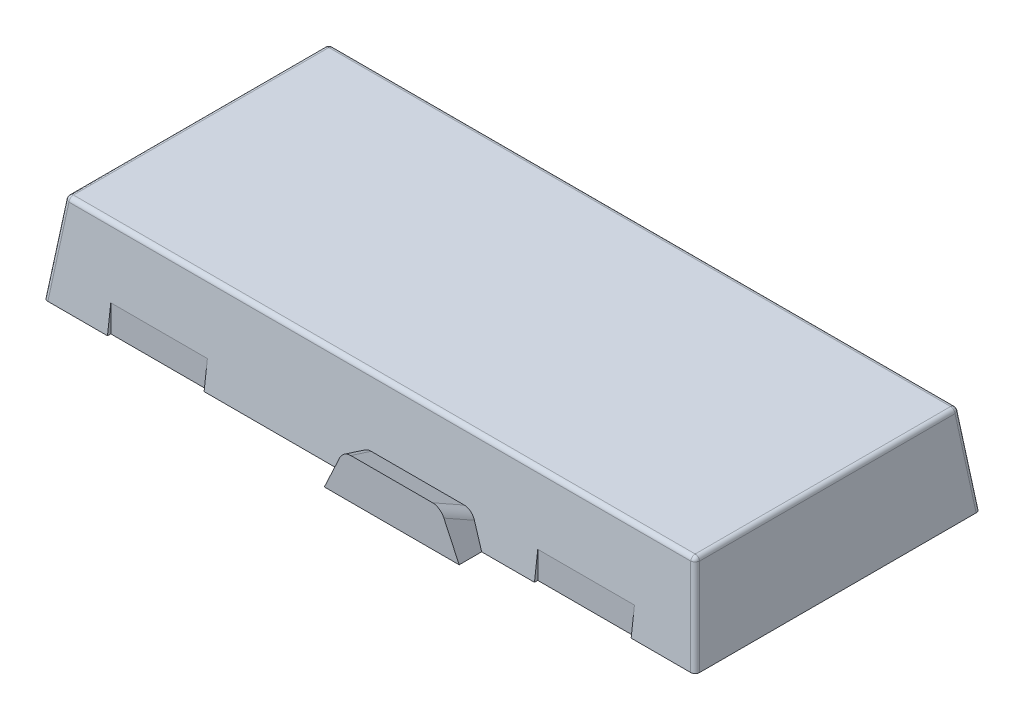
ISO-10303-21;
HEADER;
FILE_DESCRIPTION(('STEP AP214'),'2;1');
FILE_NAME('part.step','',(''),(''),'','','');
FILE_SCHEMA(('AUTOMOTIVE_DESIGN { 1 0 10303 214 1 1 1 1 }'));
ENDSEC;
DATA;
#1=APPLICATION_CONTEXT('core data for automotive mechanical design processes');
#2=APPLICATION_PROTOCOL_DEFINITION('international standard','automotive_design',2000,#1);
#3=PRODUCT_CONTEXT('',#1,'mechanical');
#4=PRODUCT('Part','Part','',(#3));
#5=PRODUCT_RELATED_PRODUCT_CATEGORY('part','',(#4));
#6=PRODUCT_DEFINITION_FORMATION('','',#4);
#7=PRODUCT_DEFINITION_CONTEXT('part definition',#1,'design');
#8=PRODUCT_DEFINITION('design','',#6,#7);
#9=PRODUCT_DEFINITION_SHAPE('','',#8);
#10=(LENGTH_UNIT() NAMED_UNIT(*) SI_UNIT(.MILLI.,.METRE.));
#11=(NAMED_UNIT(*) PLANE_ANGLE_UNIT() SI_UNIT($,.RADIAN.));
#12=(NAMED_UNIT(*) SI_UNIT($,.STERADIAN.) SOLID_ANGLE_UNIT());
#13=UNCERTAINTY_MEASURE_WITH_UNIT(LENGTH_MEASURE(1.E-05),#10,'distance_accuracy_value','');
#14=(GEOMETRIC_REPRESENTATION_CONTEXT(3) GLOBAL_UNCERTAINTY_ASSIGNED_CONTEXT((#13)) GLOBAL_UNIT_ASSIGNED_CONTEXT((#10,
#11,#12)) REPRESENTATION_CONTEXT('',''));
#15=CARTESIAN_POINT('',(0.,0.,0.));
#16=DIRECTION('',(0.,0.,1.));
#17=DIRECTION('',(1.,0.,0.));
#18=AXIS2_PLACEMENT_3D('',#15,#16,#17);
#19=CARTESIAN_POINT('',(1.11499999999994,0.,-1.25526585269165));
#20=DIRECTION('',(0.,0.,-1.));
#21=DIRECTION('',(-1.,0.,0.));
#22=AXIS2_PLACEMENT_3D('',#19,#20,#21);
#23=PLANE('',#22);
#24=DIRECTION('',(0.,-1.,0.));
#25=VECTOR('',#24,1.);
#26=CARTESIAN_POINT('',(0.284999999999941,0.,-1.25526585269164));
#27=LINE('',#26,#25);
#28=CARTESIAN_POINT('',(0.284999999999941,0.119999999999981,-1.25526585269164));
#29=VERTEX_POINT('',#28);
#30=CARTESIAN_POINT('',(0.284999999999941,0.,-1.25526585269164));
#31=VERTEX_POINT('',#30);
#32=EDGE_CURVE('E11',#29,#31,#27,.T.);
#33=ORIENTED_EDGE('',*,*,#32,.F.);
#34=DIRECTION('',(-1.,0.,0.));
#35=VECTOR('',#34,1.);
#36=CARTESIAN_POINT('',(1.11499999999994,0.119999999999981,-1.25526585269165));
#37=LINE('',#36,#35);
#38=CARTESIAN_POINT('',(1.11499999999994,0.119999999999981,-1.25526585269165));
#39=VERTEX_POINT('',#38);
#40=EDGE_CURVE('E385',#39,#29,#37,.T.);
#41=ORIENTED_EDGE('',*,*,#40,.F.);
#42=DIRECTION('',(0.,-1.,0.));
#43=VECTOR('',#42,1.);
#44=CARTESIAN_POINT('',(1.11499999999994,0.,-1.25526585269165));
#45=LINE('',#44,#43);
#46=CARTESIAN_POINT('',(1.11499999999994,0.,-1.25526585269165));
#47=VERTEX_POINT('',#46);
#48=EDGE_CURVE('E19',#39,#47,#45,.T.);
#49=ORIENTED_EDGE('',*,*,#48,.T.);
#50=DIRECTION('',(-1.,0.,0.));
#51=VECTOR('',#50,1.);
#52=CARTESIAN_POINT('',(1.11499999999994,0.,-1.25526585269165));
#53=LINE('',#52,#51);
#54=EDGE_CURVE('E407',#47,#31,#53,.T.);
#55=ORIENTED_EDGE('',*,*,#54,.T.);
#56=EDGE_LOOP('',(#33,#41,#49,#55));
#57=FACE_BOUND('',#56,.T.);
#58=ADVANCED_FACE('F16',(#57),#23,.T.);
#59=CARTESIAN_POINT('',(0.28499999999994,0.16999999999998,-1.41026585269164));
#60=DIRECTION('',(1.,0.,0.));
#61=DIRECTION('',(0.,0.,-1.));
#62=AXIS2_PLACEMENT_3D('',#59,#60,#61);
#63=PLANE('',#62);
#64=DIRECTION('',(0.,0.992546151641322,0.121869343405148));
#65=VECTOR('',#64,1.);
#66=CARTESIAN_POINT('',(0.284999999999941,0.,-1.27));
#67=LINE('',#66,#65);
#68=CARTESIAN_POINT('',(0.284999999999941,0.,-1.27));
#69=VERTEX_POINT('',#68);
#70=EDGE_CURVE('E387',#69,#29,#67,.T.);
#71=ORIENTED_EDGE('',*,*,#70,.T.);
#72=ORIENTED_EDGE('',*,*,#32,.T.);
#73=DIRECTION('',(0.,0.,-1.));
#74=VECTOR('',#73,1.);
#75=CARTESIAN_POINT('',(0.284999999999941,0.,-1.25526585269164));
#76=LINE('',#75,#74);
#77=EDGE_CURVE('E343',#31,#69,#76,.T.);
#78=ORIENTED_EDGE('',*,*,#77,.T.);
#79=EDGE_LOOP('',(#71,#72,#78));
#80=FACE_BOUND('',#79,.T.);
#81=ADVANCED_FACE('F1197',(#80),#63,.T.);
#82=CARTESIAN_POINT('',(1.11499999999994,0.16999999999998,-1.41026585269165));
#83=DIRECTION('',(1.,0.,0.));
#84=DIRECTION('',(0.,0.,-1.));
#85=AXIS2_PLACEMENT_3D('',#82,#83,#84);
#86=PLANE('',#85);
#87=DIRECTION('',(0.,0.,-1.));
#88=VECTOR('',#87,1.);
#89=CARTESIAN_POINT('',(1.11499999999994,0.,-1.25526585269165));
#90=LINE('',#89,#88);
#91=CARTESIAN_POINT('',(1.11499999999994,0.,-1.27));
#92=VERTEX_POINT('',#91);
#93=EDGE_CURVE('E489',#47,#92,#90,.T.);
#94=ORIENTED_EDGE('',*,*,#93,.F.);
#95=ORIENTED_EDGE('',*,*,#48,.F.);
#96=DIRECTION('',(0.,0.992546151641322,0.121869343405148));
#97=VECTOR('',#96,1.);
#98=CARTESIAN_POINT('',(1.11499999999994,0.,-1.27));
#99=LINE('',#98,#97);
#100=EDGE_CURVE('E390',#92,#39,#99,.T.);
#101=ORIENTED_EDGE('',*,*,#100,.F.);
#102=EDGE_LOOP('',(#94,#95,#101));
#103=FACE_BOUND('',#102,.T.);
#104=ADVANCED_FACE('F1190',(#103),#86,.F.);
#105=CARTESIAN_POINT('',(2.61499999999994,0.,-1.25526585269167));
#106=DIRECTION('',(0.,0.,-1.));
#107=DIRECTION('',(-1.,0.,0.));
#108=AXIS2_PLACEMENT_3D('',#105,#106,#107);
#109=PLANE('',#108);
#110=DIRECTION('',(0.,-1.,0.));
#111=VECTOR('',#110,1.);
#112=CARTESIAN_POINT('',(2.18499999999994,0.,-1.25526585269166));
#113=LINE('',#112,#111);
#114=CARTESIAN_POINT('',(2.18499999999994,0.119999999999981,-1.25526585269166));
#115=VERTEX_POINT('',#114);
#116=CARTESIAN_POINT('',(2.18499999999994,0.,-1.25526585269166));
#117=VERTEX_POINT('',#116);
#118=EDGE_CURVE('E418',#115,#117,#113,.T.);
#119=ORIENTED_EDGE('',*,*,#118,.F.);
#120=DIRECTION('',(-1.,0.,0.));
#121=VECTOR('',#120,1.);
#122=CARTESIAN_POINT('',(2.61499999999994,0.119999999999981,-1.25526585269167));
#123=LINE('',#122,#121);
#124=CARTESIAN_POINT('',(2.61499999999994,0.119999999999981,-1.25526585269167));
#125=VERTEX_POINT('',#124);
#126=EDGE_CURVE('E511',#125,#115,#123,.T.);
#127=ORIENTED_EDGE('',*,*,#126,.F.);
#128=DIRECTION('',(0.,-1.,0.));
#129=VECTOR('',#128,1.);
#130=CARTESIAN_POINT('',(2.61499999999994,0.,-1.25526585269167));
#131=LINE('',#130,#129);
#132=CARTESIAN_POINT('',(2.61499999999994,0.,-1.25526585269167));
#133=VERTEX_POINT('',#132);
#134=EDGE_CURVE('E413',#125,#133,#131,.T.);
#135=ORIENTED_EDGE('',*,*,#134,.T.);
#136=DIRECTION('',(-1.,0.,0.));
#137=VECTOR('',#136,1.);
#138=CARTESIAN_POINT('',(2.61499999999994,0.,-1.25526585269167));
#139=LINE('',#138,#137);
#140=EDGE_CURVE('E416',#133,#117,#139,.T.);
#141=ORIENTED_EDGE('',*,*,#140,.T.);
#142=EDGE_LOOP('',(#119,#127,#135,#141));
#143=FACE_BOUND('',#142,.T.);
#144=ADVANCED_FACE('F1178',(#143),#109,.T.);
#145=CARTESIAN_POINT('',(2.18499999999994,0.16999999999998,-1.41026585269166));
#146=DIRECTION('',(1.,0.,0.));
#147=DIRECTION('',(0.,0.,-1.));
#148=AXIS2_PLACEMENT_3D('',#145,#146,#147);
#149=PLANE('',#148);
#150=DIRECTION('',(0.,0.992546151641322,0.121869343405148));
#151=VECTOR('',#150,1.);
#152=CARTESIAN_POINT('',(2.18499999999994,0.,-1.27));
#153=LINE('',#152,#151);
#154=CARTESIAN_POINT('',(2.18499999999994,0.,-1.27));
#155=VERTEX_POINT('',#154);
#156=EDGE_CURVE('E516',#155,#115,#153,.T.);
#157=ORIENTED_EDGE('',*,*,#156,.T.);
#158=ORIENTED_EDGE('',*,*,#118,.T.);
#159=DIRECTION('',(0.,0.,-1.));
#160=VECTOR('',#159,1.);
#161=CARTESIAN_POINT('',(2.18499999999994,0.,-1.25526585269166));
#162=LINE('',#161,#160);
#163=EDGE_CURVE('E425',#117,#155,#162,.T.);
#164=ORIENTED_EDGE('',*,*,#163,.T.);
#165=EDGE_LOOP('',(#157,#158,#164));
#166=FACE_BOUND('',#165,.T.);
#167=ADVANCED_FACE('F1167',(#166),#149,.T.);
#168=CARTESIAN_POINT('',(2.61499999999994,0.16999999999998,-1.41026585269167));
#169=DIRECTION('',(1.,0.,0.));
#170=DIRECTION('',(0.,0.,-1.));
#171=AXIS2_PLACEMENT_3D('',#168,#169,#170);
#172=PLANE('',#171);
#173=DIRECTION('',(0.,0.,-1.));
#174=VECTOR('',#173,1.);
#175=CARTESIAN_POINT('',(2.61499999999994,0.,-1.25526585269167));
#176=LINE('',#175,#174);
#177=CARTESIAN_POINT('',(2.61499999999994,0.,-1.27));
#178=VERTEX_POINT('',#177);
#179=EDGE_CURVE('E349',#133,#178,#176,.T.);
#180=ORIENTED_EDGE('',*,*,#179,.F.);
#181=ORIENTED_EDGE('',*,*,#134,.F.);
#182=DIRECTION('',(0.,0.992546151641322,0.121869343405148));
#183=VECTOR('',#182,1.);
#184=CARTESIAN_POINT('',(2.61499999999994,0.,-1.27));
#185=LINE('',#184,#183);
#186=EDGE_CURVE('E506',#178,#125,#185,.T.);
#187=ORIENTED_EDGE('',*,*,#186,.F.);
#188=EDGE_LOOP('',(#180,#181,#187));
#189=FACE_BOUND('',#188,.T.);
#190=ADVANCED_FACE('F1158',(#189),#172,.F.);
#191=CARTESIAN_POINT('',(2.18499999999997,0.,-0.0147341473083439));
#192=DIRECTION('',(0.,0.,1.));
#193=DIRECTION('',(0.,-1.,0.));
#194=AXIS2_PLACEMENT_3D('',#191,#192,#193);
#195=PLANE('',#194);
#196=DIRECTION('',(0.,-1.,0.));
#197=VECTOR('',#196,1.);
#198=CARTESIAN_POINT('',(2.615,0.,-0.0147341473083454));
#199=LINE('',#198,#197);
#200=CARTESIAN_POINT('',(2.615,0.119999999999989,-0.0147341473083463));
#201=VERTEX_POINT('',#200);
#202=CARTESIAN_POINT('',(2.615,0.,-0.0147341473083463));
#203=VERTEX_POINT('',#202);
#204=EDGE_CURVE('E417',#201,#203,#199,.T.);
#205=ORIENTED_EDGE('',*,*,#204,.F.);
#206=DIRECTION('',(1.,0.,0.));
#207=VECTOR('',#206,1.);
#208=CARTESIAN_POINT('',(2.18499999999997,0.119999999999989,-0.0147341473083448));
#209=LINE('',#208,#207);
#210=CARTESIAN_POINT('',(2.18499999999997,0.119999999999989,-0.0147341473083448));
#211=VERTEX_POINT('',#210);
#212=EDGE_CURVE('E299',#211,#201,#209,.T.);
#213=ORIENTED_EDGE('',*,*,#212,.F.);
#214=DIRECTION('',(0.,-1.,0.));
#215=VECTOR('',#214,1.);
#216=CARTESIAN_POINT('',(2.18499999999997,0.,-0.0147341473083439));
#217=LINE('',#216,#215);
#218=CARTESIAN_POINT('',(2.18499999999997,0.,-0.0147341473083439));
#219=VERTEX_POINT('',#218);
#220=EDGE_CURVE('E584',#211,#219,#217,.T.);
#221=ORIENTED_EDGE('',*,*,#220,.T.);
#222=DIRECTION('',(1.,0.,0.));
#223=VECTOR('',#222,1.);
#224=CARTESIAN_POINT('',(2.18499999999997,0.,-0.0147341473083439));
#225=LINE('',#224,#223);
#226=EDGE_CURVE('E304',#219,#203,#225,.T.);
#227=ORIENTED_EDGE('',*,*,#226,.T.);
#228=EDGE_LOOP('',(#205,#213,#221,#227));
#229=FACE_BOUND('',#228,.T.);
#230=ADVANCED_FACE('F600',(#229),#195,.T.);
#231=CARTESIAN_POINT('',(2.615,0.16999999999999,0.140265852691653));
#232=DIRECTION('',(-1.,0.,0.));
#233=DIRECTION('',(0.,1.,0.));
#234=AXIS2_PLACEMENT_3D('',#231,#232,#233);
#235=PLANE('',#234);
#236=DIRECTION('',(0.,0.992546151641322,-0.121869343405148));
#237=VECTOR('',#236,1.);
#238=CARTESIAN_POINT('',(2.615,0.,0.));
#239=LINE('',#238,#237);
#240=CARTESIAN_POINT('',(2.615,0.,0.));
#241=VERTEX_POINT('',#240);
#242=EDGE_CURVE('E293',#241,#201,#239,.T.);
#243=ORIENTED_EDGE('',*,*,#242,.T.);
#244=ORIENTED_EDGE('',*,*,#204,.T.);
#245=DIRECTION('',(0.,0.,1.));
#246=VECTOR('',#245,1.);
#247=CARTESIAN_POINT('',(2.615,0.,-0.0147341473083454));
#248=LINE('',#247,#246);
#249=EDGE_CURVE('E277',#203,#241,#248,.T.);
#250=ORIENTED_EDGE('',*,*,#249,.T.);
#251=EDGE_LOOP('',(#243,#244,#250));
#252=FACE_BOUND('',#251,.T.);
#253=ADVANCED_FACE('F593',(#252),#235,.T.);
#254=CARTESIAN_POINT('',(2.18499999999997,0.16999999999999,0.140265852691655));
#255=DIRECTION('',(-1.,0.,0.));
#256=DIRECTION('',(0.,1.,0.));
#257=AXIS2_PLACEMENT_3D('',#254,#255,#256);
#258=PLANE('',#257);
#259=DIRECTION('',(0.,0.,1.));
#260=VECTOR('',#259,1.);
#261=CARTESIAN_POINT('',(2.18499999999997,0.,-0.0147341473083439));
#262=LINE('',#261,#260);
#263=CARTESIAN_POINT('',(2.18499999999997,0.,0.));
#264=VERTEX_POINT('',#263);
#265=EDGE_CURVE('E310',#219,#264,#262,.T.);
#266=ORIENTED_EDGE('',*,*,#265,.F.);
#267=ORIENTED_EDGE('',*,*,#220,.F.);
#268=DIRECTION('',(0.,0.992546151641322,-0.121869343405148));
#269=VECTOR('',#268,1.);
#270=CARTESIAN_POINT('',(2.18499999999997,0.,0.));
#271=LINE('',#270,#269);
#272=EDGE_CURVE('E346',#264,#211,#271,.T.);
#273=ORIENTED_EDGE('',*,*,#272,.F.);
#274=EDGE_LOOP('',(#266,#267,#273));
#275=FACE_BOUND('',#274,.T.);
#276=ADVANCED_FACE('F605',(#275),#258,.F.);
#277=CARTESIAN_POINT('',(0.284999999999966,0.,-0.0147341473083285));
#278=DIRECTION('',(0.,0.,1.));
#279=DIRECTION('',(0.,-1.,0.));
#280=AXIS2_PLACEMENT_3D('',#277,#278,#279);
#281=PLANE('',#280);
#282=DIRECTION('',(0.,-1.,0.));
#283=VECTOR('',#282,1.);
#284=CARTESIAN_POINT('',(0.714999999999966,0.,-0.01473414730833));
#285=LINE('',#284,#283);
#286=CARTESIAN_POINT('',(0.714999999999966,0.119999999999918,-0.0147341473083309));
#287=VERTEX_POINT('',#286);
#288=CARTESIAN_POINT('',(0.714999999999966,0.,-0.0147341473083309));
#289=VERTEX_POINT('',#288);
#290=EDGE_CURVE('E585',#287,#289,#285,.T.);
#291=ORIENTED_EDGE('',*,*,#290,.F.);
#292=DIRECTION('',(1.,0.,0.));
#293=VECTOR('',#292,1.);
#294=CARTESIAN_POINT('',(0.284999999999966,0.119999999999918,-0.0147341473083294));
#295=LINE('',#294,#293);
#296=CARTESIAN_POINT('',(0.284999999999966,0.119999999999918,-0.0147341473083294));
#297=VERTEX_POINT('',#296);
#298=EDGE_CURVE('E331',#297,#287,#295,.T.);
#299=ORIENTED_EDGE('',*,*,#298,.F.);
#300=DIRECTION('',(0.,-1.,0.));
#301=VECTOR('',#300,1.);
#302=CARTESIAN_POINT('',(0.284999999999966,0.,-0.0147341473083285));
#303=LINE('',#302,#301);
#304=CARTESIAN_POINT('',(0.284999999999966,0.,-0.0147341473083285));
#305=VERTEX_POINT('',#304);
#306=EDGE_CURVE('E370',#297,#305,#303,.T.);
#307=ORIENTED_EDGE('',*,*,#306,.T.);
#308=DIRECTION('',(1.,0.,0.));
#309=VECTOR('',#308,1.);
#310=CARTESIAN_POINT('',(0.284999999999966,0.,-0.0147341473083285));
#311=LINE('',#310,#309);
#312=EDGE_CURVE('E538',#305,#289,#311,.T.);
#313=ORIENTED_EDGE('',*,*,#312,.T.);
#314=EDGE_LOOP('',(#291,#299,#307,#313));
#315=FACE_BOUND('',#314,.T.);
#316=ADVANCED_FACE('F1126',(#315),#281,.T.);
#317=CARTESIAN_POINT('',(0.714999999999966,0.169999999999919,0.140265852691669));
#318=DIRECTION('',(-1.,0.,0.));
#319=DIRECTION('',(0.,1.,0.));
#320=AXIS2_PLACEMENT_3D('',#317,#318,#319);
#321=PLANE('',#320);
#322=DIRECTION('',(0.,0.992546151641322,-0.121869343405148));
#323=VECTOR('',#322,1.);
#324=CARTESIAN_POINT('',(0.714999999999966,0.,0.));
#325=LINE('',#324,#323);
#326=CARTESIAN_POINT('',(0.714999999999966,0.,0.));
#327=VERTEX_POINT('',#326);
#328=EDGE_CURVE('E404',#327,#287,#325,.T.);
#329=ORIENTED_EDGE('',*,*,#328,.T.);
#330=ORIENTED_EDGE('',*,*,#290,.T.);
#331=DIRECTION('',(0.,0.,1.));
#332=VECTOR('',#331,1.);
#333=CARTESIAN_POINT('',(0.714999999999966,0.,-0.01473414730833));
#334=LINE('',#333,#332);
#335=EDGE_CURVE('E532',#289,#327,#334,.T.);
#336=ORIENTED_EDGE('',*,*,#335,.T.);
#337=EDGE_LOOP('',(#329,#330,#336));
#338=FACE_BOUND('',#337,.T.);
#339=ADVANCED_FACE('F1120',(#338),#321,.T.);
#340=CARTESIAN_POINT('',(0.284999999999966,0.169999999999919,0.14026585269167));
#341=DIRECTION('',(-1.,0.,0.));
#342=DIRECTION('',(0.,1.,0.));
#343=AXIS2_PLACEMENT_3D('',#340,#341,#342);
#344=PLANE('',#343);
#345=DIRECTION('',(0.,0.,1.));
#346=VECTOR('',#345,1.);
#347=CARTESIAN_POINT('',(0.284999999999966,0.,-0.0147341473083285));
#348=LINE('',#347,#346);
#349=CARTESIAN_POINT('',(0.284999999999966,0.,0.));
#350=VERTEX_POINT('',#349);
#351=EDGE_CURVE('E545',#305,#350,#348,.T.);
#352=ORIENTED_EDGE('',*,*,#351,.F.);
#353=ORIENTED_EDGE('',*,*,#306,.F.);
#354=DIRECTION('',(0.,0.992546151641322,-0.121869343405148));
#355=VECTOR('',#354,1.);
#356=CARTESIAN_POINT('',(0.284999999999966,0.,0.));
#357=LINE('',#356,#355);
#358=EDGE_CURVE('E329',#350,#297,#357,.T.);
#359=ORIENTED_EDGE('',*,*,#358,.F.);
#360=EDGE_LOOP('',(#352,#353,#359));
#361=FACE_BOUND('',#360,.T.);
#362=ADVANCED_FACE('F1106',(#361),#344,.F.);
#363=CARTESIAN_POINT('',(1.48786303854277,0.177338161079829,0.212601747172039));
#364=DIRECTION('',(-0.193351336560282,-0.414643279343292,-0.889205382094482));
#365=DIRECTION('',(0.,0.906307787036653,-0.422618261740694));
#366=AXIS2_PLACEMENT_3D('',#363,#364,#365);
#367=CYLINDRICAL_SURFACE('',#366,0.05);
#368=CARTESIAN_POINT('',(1.43965953770174,0.0739654199333658,-0.00908181160851722));
#369=DIRECTION('',(0.,-0.121869343405149,-0.992546151641322));
#370=DIRECTION('',(0.537696620845256,0.836853763848105,-0.102752721934034));
#371=AXIS2_PLACEMENT_3D('',#368,#369,#370);
#372=ELLIPSE('',#371,0.0535842686510647,0.050000000000033);
#373=CARTESIAN_POINT('',(1.39381053434803,0.0939519941005674,-0.0115358543415904));
#374=VERTEX_POINT('',#373);
#375=CARTESIAN_POINT('',(1.44286113607182,0.126146659146598,-0.0154888621526834));
#376=VERTEX_POINT('',#375);
#377=EDGE_CURVE('E429',#374,#376,#372,.T.);
#378=ORIENTED_EDGE('',*,*,#377,.F.);
#379=DIRECTION('',(-0.193351336560282,-0.414643279343292,-0.889205382094482));
#380=VECTOR('',#379,1.);
#381=CARTESIAN_POINT('',(1.39627324560273,0.0992332954295023,-0.000210067092393246));
#382=LINE('',#381,#380);
#383=CARTESIAN_POINT('',(1.41806320639162,0.145962017138911,0.1));
#384=VERTEX_POINT('',#383);
#385=EDGE_CURVE('E312',#384,#374,#382,.T.);
#386=ORIENTED_EDGE('',*,*,#385,.F.);
#387=CARTESIAN_POINT('',(1.46337859574348,0.124831104051841,0.1));
#388=DIRECTION('',(0.,0.,1.));
#389=DIRECTION('',(-0.422618261739186,-0.906307787037356,0.));
#390=AXIS2_PLACEMENT_3D('',#387,#388,#389);
#391=ELLIPSE('',#390,0.0562299790429186,0.0500000000000318);
#392=CARTESIAN_POINT('',(1.46797336132899,0.18,0.1));
#393=VERTEX_POINT('',#392);
#394=EDGE_CURVE('E574',#393,#384,#391,.T.);
#395=ORIENTED_EDGE('',*,*,#394,.F.);
#396=DIRECTION('',(0.193351336560282,0.414643279343292,0.889205382094482));
#397=VECTOR('',#396,1.);
#398=CARTESIAN_POINT('',(1.46670086021174,0.177271112547702,0.0941478819732555));
#399=LINE('',#398,#397);
#400=EDGE_CURVE('E40',#376,#393,#399,.T.);
#401=ORIENTED_EDGE('',*,*,#400,.F.);
#402=EDGE_LOOP('',(#378,#386,#395,#401));
#403=FACE_BOUND('',#402,.T.);
#404=ADVANCED_FACE('F1097',(#403),#367,.T.);
#405=CARTESIAN_POINT('',(1.83830627900198,0.121217878500095,0.0922514127988442));
#406=DIRECTION('',(-0.193351336560282,0.414643279343292,0.889205382094482));
#407=DIRECTION('',(0.,-0.906307787036653,0.422618261740694));
#408=AXIS2_PLACEMENT_3D('',#405,#406,#407);
#409=CYLINDRICAL_SURFACE('',#408,0.05);
#410=CARTESIAN_POINT('',(1.83662140425657,0.124831104051922,0.1));
#411=DIRECTION('',(0.,0.,1.));
#412=DIRECTION('',(0.422618261742725,-0.906307787035705,0.));
#413=AXIS2_PLACEMENT_3D('',#410,#411,#412);
#414=ELLIPSE('',#413,0.0562299790428572,0.0499999999999584);
#415=CARTESIAN_POINT('',(1.88193679360838,0.145962017138911,0.1));
#416=VERTEX_POINT('',#415);
#417=CARTESIAN_POINT('',(1.83202663867101,0.18,0.1));
#418=VERTEX_POINT('',#417);
#419=EDGE_CURVE('E452',#416,#418,#414,.T.);
#420=ORIENTED_EDGE('',*,*,#419,.F.);
#421=DIRECTION('',(-0.193351336560282,0.414643279343292,0.889205382094482));
#422=VECTOR('',#421,1.);
#423=CARTESIAN_POINT('',(1.87861452914009,0.153086636282905,0.11527879506029));
#424=LINE('',#423,#422);
#425=CARTESIAN_POINT('',(1.90618946565197,0.0939519941005674,-0.0115358543415904));
#426=VERTEX_POINT('',#425);
#427=EDGE_CURVE('E353',#426,#416,#424,.T.);
#428=ORIENTED_EDGE('',*,*,#427,.F.);
#429=CARTESIAN_POINT('',(1.8603404622983,0.0739654199334369,-0.00908181160852585));
#430=DIRECTION('',(0.,-0.121869343405151,-0.992546151641322));
#431=DIRECTION('',(-0.537696620849827,0.836853763845212,-0.10275272193368));
#432=AXIS2_PLACEMENT_3D('',#429,#430,#431);
#433=ELLIPSE('',#432,0.0535842686510161,0.0499999999999635);
#434=CARTESIAN_POINT('',(1.85713886392818,0.126146659146598,-0.0154888621526834));
#435=VERTEX_POINT('',#434);
#436=EDGE_CURVE('E309',#435,#426,#433,.T.);
#437=ORIENTED_EDGE('',*,*,#436,.F.);
#438=DIRECTION('',(0.193351336560282,-0.414643279343292,-0.889205382094482));
#439=VECTOR('',#438,1.);
#440=CARTESIAN_POINT('',(1.85841136504543,0.1234177716943,-0.021340980179428));
#441=LINE('',#440,#439);
#442=EDGE_CURVE('E50',#418,#435,#441,.T.);
#443=ORIENTED_EDGE('',*,*,#442,.F.);
#444=EDGE_LOOP('',(#420,#428,#437,#443));
#445=FACE_BOUND('',#444,.T.);
#446=ADVANCED_FACE('F1087',(#445),#409,.T.);
#447=CARTESIAN_POINT('',(2.,0.18,0.1));
#448=DIRECTION('',(0.,0.906307787036653,-0.422618261740694));
#449=DIRECTION('',(-1.,0.,0.));
#450=AXIS2_PLACEMENT_3D('',#447,#448,#449);
#451=PLANE('',#450);
#452=DIRECTION('',(-1.,0.,0.));
#453=VECTOR('',#452,1.);
#454=CARTESIAN_POINT('',(1.8660646215321,0.18,0.1));
#455=LINE('',#454,#453);
#456=EDGE_CURVE('E571',#418,#393,#455,.T.);
#457=ORIENTED_EDGE('',*,*,#456,.F.);
#458=ORIENTED_EDGE('',*,*,#442,.T.);
#459=DIRECTION('',(-1.,0.,0.));
#460=VECTOR('',#459,1.);
#461=CARTESIAN_POINT('',(2.,0.126146659146598,-0.0154888621526834));
#462=LINE('',#461,#460);
#463=EDGE_CURVE('E314',#435,#376,#462,.T.);
#464=ORIENTED_EDGE('',*,*,#463,.T.);
#465=ORIENTED_EDGE('',*,*,#400,.T.);
#466=EDGE_LOOP('',(#457,#458,#464,#465));
#467=FACE_BOUND('',#466,.T.);
#468=ADVANCED_FACE('F1079',(#467),#451,.T.);
#469=CARTESIAN_POINT('',(0.,0.,0.1));
#470=DIRECTION('',(0.,0.,1.));
#471=DIRECTION('',(1.,0.,0.));
#472=AXIS2_PLACEMENT_3D('',#469,#470,#471);
#473=PLANE('',#472);
#474=DIRECTION('',(-0.422618261740704,0.906307787036648,0.));
#475=VECTOR('',#474,1.);
#476=CARTESIAN_POINT('',(1.8660646215321,0.18,0.1));
#477=LINE('',#476,#475);
#478=CARTESIAN_POINT('',(1.95,0.,0.1));
#479=VERTEX_POINT('',#478);
#480=EDGE_CURVE('E324',#479,#416,#477,.T.);
#481=ORIENTED_EDGE('',*,*,#480,.T.);
#482=ORIENTED_EDGE('',*,*,#419,.T.);
#483=ORIENTED_EDGE('',*,*,#456,.T.);
#484=ORIENTED_EDGE('',*,*,#394,.T.);
#485=DIRECTION('',(-0.422618261740704,-0.906307787036648,0.));
#486=VECTOR('',#485,1.);
#487=CARTESIAN_POINT('',(1.4339353784679,0.18,0.1));
#488=LINE('',#487,#486);
#489=CARTESIAN_POINT('',(1.35,0.,0.1));
#490=VERTEX_POINT('',#489);
#491=EDGE_CURVE('E302',#384,#490,#488,.T.);
#492=ORIENTED_EDGE('',*,*,#491,.T.);
#493=DIRECTION('',(1.,0.,0.));
#494=VECTOR('',#493,1.);
#495=CARTESIAN_POINT('',(1.35,0.,0.1));
#496=LINE('',#495,#494);
#497=EDGE_CURVE('E461',#490,#479,#496,.T.);
#498=ORIENTED_EDGE('',*,*,#497,.T.);
#499=EDGE_LOOP('',(#481,#482,#483,#484,#492,#498));
#500=FACE_BOUND('',#499,.T.);
#501=ADVANCED_FACE('F620',(#500),#473,.T.);
#502=CARTESIAN_POINT('',(2.88043959084108,-0.00480343249931864,-0.0195604091589214));
#503=DIRECTION('',(0.120974291151355,-0.985256536015293,0.120974291151355));
#504=DIRECTION('',(0.,-0.121869343405148,-0.992546151641322));
#505=AXIS2_PLACEMENT_3D('',#502,#503,#504);
#506=CYLINDRICAL_SURFACE('',#505,0.02);
#507=CARTESIAN_POINT('',(2.83319167034772,0.38,-0.0668083296522808));
#508=DIRECTION('',(0.120974291151358,-0.985256536015293,0.120974291151356));
#509=DIRECTION('',(-0.992546151641322,-0.121869343405151,0.));
#510=AXIS2_PLACEMENT_3D('',#507,#508,#509);
#511=CIRCLE('',#510,0.02);
#512=CARTESIAN_POINT('',(2.85304259338055,0.382437386868103,-0.0668083296522808));
#513=VERTEX_POINT('',#512);
#514=CARTESIAN_POINT('',(2.83319167034772,0.382437386868103,-0.0469574066194544));
#515=VERTEX_POINT('',#514);
#516=EDGE_CURVE('E282',#513,#515,#511,.T.);
#517=ORIENTED_EDGE('',*,*,#516,.T.);
#518=DIRECTION('',(-0.120974291151355,0.985256536015293,-0.120974291151355));
#519=VECTOR('',#518,1.);
#520=CARTESIAN_POINT('',(2.83799873139432,0.343287016404183,-0.042150345572856));
#521=LINE('',#520,#519);
#522=CARTESIAN_POINT('',(2.88014907696717,0.,0.));
#523=VERTEX_POINT('',#522);
#524=EDGE_CURVE('E278',#523,#515,#521,.T.);
#525=ORIENTED_EDGE('',*,*,#524,.F.);
#526=CARTESIAN_POINT('',(2.87984980349082,0.,-0.020150196509177));
#527=DIRECTION('',(0.,-1.,0.));
#528=DIRECTION('',(-0.707106781186548,0.,-0.707106781186547));
#529=AXIS2_PLACEMENT_3D('',#526,#527,#528);
#530=ELLIPSE('',#529,0.0202992817290882,0.02);
#531=CARTESIAN_POINT('',(2.9,0.,-0.0198509230328264));
#532=VERTEX_POINT('',#531);
#533=EDGE_CURVE('E263',#532,#523,#530,.T.);
#534=ORIENTED_EDGE('',*,*,#533,.F.);
#535=DIRECTION('',(0.120974291151355,-0.985256536015293,0.120974291151355));
#536=VECTOR('',#535,1.);
#537=CARTESIAN_POINT('',(2.90029051387391,-0.00236604563121569,-0.0195604091589214));
#538=LINE('',#537,#536);
#539=EDGE_CURVE('E394',#513,#532,#538,.T.);
#540=ORIENTED_EDGE('',*,*,#539,.F.);
#541=EDGE_LOOP('',(#517,#525,#534,#540));
#542=FACE_BOUND('',#541,.T.);
#543=ADVANCED_FACE('F281',(#542),#506,.T.);
#544=CARTESIAN_POINT('',(2.83319167034772,0.38,-0.0668083296522808));
#545=DIRECTION('',(0.,1.,0.));
#546=DIRECTION('',(1.,0.,0.));
#547=AXIS2_PLACEMENT_3D('',#544,#545,#546);
#548=SPHERICAL_SURFACE('',#547,0.02);
#549=CARTESIAN_POINT('',(2.83319167034772,0.38,-0.0668083296522808));
#550=DIRECTION('',(0.,0.,1.));
#551=DIRECTION('',(0.,-1.,0.));
#552=AXIS2_PLACEMENT_3D('',#549,#550,#551);
#553=CIRCLE('',#552,0.02);
#554=CARTESIAN_POINT('',(2.83319167034772,0.4,-0.0668083296522808));
#555=VERTEX_POINT('',#554);
#556=EDGE_CURVE('E454',#513,#555,#553,.T.);
#557=ORIENTED_EDGE('',*,*,#556,.T.);
#558=CARTESIAN_POINT('',(2.83319167034772,0.38,-0.0668083296522808));
#559=DIRECTION('',(1.,0.,0.));
#560=DIRECTION('',(0.,0.,-1.));
#561=AXIS2_PLACEMENT_3D('',#558,#559,#560);
#562=CIRCLE('',#561,0.02);
#563=EDGE_CURVE('E474',#555,#515,#562,.T.);
#564=ORIENTED_EDGE('',*,*,#563,.T.);
#565=ORIENTED_EDGE('',*,*,#516,.F.);
#566=EDGE_LOOP('',(#557,#564,#565));
#567=FACE_BOUND('',#566,.T.);
#568=ADVANCED_FACE('F1054',(#567),#548,.T.);
#569=CARTESIAN_POINT('',(2.83319167034772,0.38,0.));
#570=DIRECTION('',(0.,0.,1.));
#571=DIRECTION('',(1.,0.,0.));
#572=AXIS2_PLACEMENT_3D('',#569,#570,#571);
#573=CYLINDRICAL_SURFACE('',#572,0.02);
#574=CARTESIAN_POINT('',(2.83319167034772,0.38,-1.20319167034772));
#575=DIRECTION('',(0.,0.,1.));
#576=DIRECTION('',(-1.,0.,0.));
#577=AXIS2_PLACEMENT_3D('',#574,#575,#576);
#578=CIRCLE('',#577,0.02);
#579=CARTESIAN_POINT('',(2.85304259338055,0.382437386868103,-1.20319167034772));
#580=VERTEX_POINT('',#579);
#581=CARTESIAN_POINT('',(2.83319167034772,0.4,-1.20319167034772));
#582=VERTEX_POINT('',#581);
#583=EDGE_CURVE('E472',#580,#582,#578,.T.);
#584=ORIENTED_EDGE('',*,*,#583,.T.);
#585=DIRECTION('',(0.,0.,-1.));
#586=VECTOR('',#585,1.);
#587=CARTESIAN_POINT('',(2.83319167034772,0.4,0.));
#588=LINE('',#587,#586);
#589=EDGE_CURVE('E449',#555,#582,#588,.T.);
#590=ORIENTED_EDGE('',*,*,#589,.F.);
#591=ORIENTED_EDGE('',*,*,#556,.F.);
#592=DIRECTION('',(0.,0.,1.));
#593=VECTOR('',#592,1.);
#594=CARTESIAN_POINT('',(2.85304259338055,0.382437386868103,0.));
#595=LINE('',#594,#593);
#596=EDGE_CURVE('E395',#580,#513,#595,.T.);
#597=ORIENTED_EDGE('',*,*,#596,.F.);
#598=EDGE_LOOP('',(#584,#590,#591,#597));
#599=FACE_BOUND('',#598,.T.);
#600=ADVANCED_FACE('F1042',(#599),#573,.T.);
#601=CARTESIAN_POINT('',(0.,0.38,-0.0668083296522808));
#602=DIRECTION('',(-1.,0.,0.));
#603=DIRECTION('',(0.,0.,1.));
#604=AXIS2_PLACEMENT_3D('',#601,#602,#603);
#605=CYLINDRICAL_SURFACE('',#604,0.02);
#606=CARTESIAN_POINT('',(0.0668083296522808,0.38,-0.0668083296522808));
#607=DIRECTION('',(1.,0.,0.));
#608=DIRECTION('',(0.,-1.,0.));
#609=AXIS2_PLACEMENT_3D('',#606,#607,#608);
#610=CIRCLE('',#609,0.02);
#611=CARTESIAN_POINT('',(0.0668083296522808,0.4,-0.0668083296522808));
#612=VERTEX_POINT('',#611);
#613=CARTESIAN_POINT('',(0.0668083296522808,0.382437386868103,-0.0469574066194544));
#614=VERTEX_POINT('',#613);
#615=EDGE_CURVE('E372',#612,#614,#610,.T.);
#616=ORIENTED_EDGE('',*,*,#615,.T.);
#617=DIRECTION('',(-1.,0.,0.));
#618=VECTOR('',#617,1.);
#619=CARTESIAN_POINT('',(0.,0.382437386868103,-0.0469574066194544));
#620=LINE('',#619,#618);
#621=EDGE_CURVE('E290',#515,#614,#620,.T.);
#622=ORIENTED_EDGE('',*,*,#621,.F.);
#623=ORIENTED_EDGE('',*,*,#563,.F.);
#624=DIRECTION('',(1.,0.,0.));
#625=VECTOR('',#624,1.);
#626=CARTESIAN_POINT('',(0.,0.4,-0.0668083296522808));
#627=LINE('',#626,#625);
#628=EDGE_CURVE('E519',#612,#555,#627,.T.);
#629=ORIENTED_EDGE('',*,*,#628,.F.);
#630=EDGE_LOOP('',(#616,#622,#623,#629));
#631=FACE_BOUND('',#630,.T.);
#632=ADVANCED_FACE('F1032',(#631),#605,.T.);
#633=CARTESIAN_POINT('',(2.83319167034772,0.38,-1.20319167034772));
#634=DIRECTION('',(0.,1.,0.));
#635=DIRECTION('',(1.,0.,0.));
#636=AXIS2_PLACEMENT_3D('',#633,#634,#635);
#637=SPHERICAL_SURFACE('',#636,0.02);
#638=CARTESIAN_POINT('',(2.83319167034772,0.38,-1.20319167034772));
#639=DIRECTION('',(-0.120974291151355,0.985256536015293,0.120974291151352));
#640=DIRECTION('',(-0.992546151641322,-0.121869343405148,0.));
#641=AXIS2_PLACEMENT_3D('',#638,#639,#640);
#642=CIRCLE('',#641,0.02);
#643=CARTESIAN_POINT('',(2.83319167034772,0.382437386868103,-1.22304259338055));
#644=VERTEX_POINT('',#643);
#645=EDGE_CURVE('E371',#580,#644,#642,.T.);
#646=ORIENTED_EDGE('',*,*,#645,.T.);
#647=CARTESIAN_POINT('',(2.83319167034772,0.38,-1.20319167034772));
#648=DIRECTION('',(1.,0.,0.));
#649=DIRECTION('',(0.,1.,0.));
#650=AXIS2_PLACEMENT_3D('',#647,#648,#649);
#651=CIRCLE('',#650,0.02);
#652=EDGE_CURVE('E374',#644,#582,#651,.T.);
#653=ORIENTED_EDGE('',*,*,#652,.T.);
#654=ORIENTED_EDGE('',*,*,#583,.F.);
#655=EDGE_LOOP('',(#646,#653,#654));
#656=FACE_BOUND('',#655,.T.);
#657=ADVANCED_FACE('F1025',(#656),#637,.T.);
#658=CARTESIAN_POINT('',(0.0668083296522808,0.38,-0.0668083296522808));
#659=DIRECTION('',(0.,1.,0.));
#660=DIRECTION('',(1.,0.,0.));
#661=AXIS2_PLACEMENT_3D('',#658,#659,#660);
#662=SPHERICAL_SURFACE('',#661,0.02);
#663=CARTESIAN_POINT('',(0.0668083296522808,0.38,-0.0668083296522808));
#664=DIRECTION('',(0.,0.,1.));
#665=DIRECTION('',(1.,0.,0.));
#666=AXIS2_PLACEMENT_3D('',#663,#664,#665);
#667=CIRCLE('',#666,0.02);
#668=CARTESIAN_POINT('',(0.0469574066194544,0.382437386868103,-0.0668083296522808));
#669=VERTEX_POINT('',#668);
#670=EDGE_CURVE('E379',#612,#669,#667,.T.);
#671=ORIENTED_EDGE('',*,*,#670,.T.);
#672=CARTESIAN_POINT('',(0.0668083296522808,0.38,-0.0668083296522808));
#673=DIRECTION('',(0.120974291151356,0.985256536015293,-0.120974291151356));
#674=DIRECTION('',(0.,0.121869343405149,0.992546151641322));
#675=AXIS2_PLACEMENT_3D('',#672,#673,#674);
#676=CIRCLE('',#675,0.02);
#677=EDGE_CURVE('E376',#669,#614,#676,.T.);
#678=ORIENTED_EDGE('',*,*,#677,.T.);
#679=ORIENTED_EDGE('',*,*,#615,.F.);
#680=EDGE_LOOP('',(#671,#678,#679));
#681=FACE_BOUND('',#680,.T.);
#682=ADVANCED_FACE('F1013',(#681),#662,.T.);
#683=CARTESIAN_POINT('',(2.83799873139432,0.34084962953608,-1.20799873139432));
#684=DIRECTION('',(0.120974291151355,-0.985256536015293,-0.120974291151355));
#685=DIRECTION('',(0.,0.121869343405148,-0.992546151641322));
#686=AXIS2_PLACEMENT_3D('',#683,#684,#685);
#687=CYLINDRICAL_SURFACE('',#686,0.02);
#688=CARTESIAN_POINT('',(2.87984980349082,0.,-1.24984980349082));
#689=DIRECTION('',(0.,-1.,0.));
#690=DIRECTION('',(0.707106781186543,0.,-0.707106781186552));
#691=AXIS2_PLACEMENT_3D('',#688,#689,#690);
#692=ELLIPSE('',#691,0.0202992817290883,0.02);
#693=CARTESIAN_POINT('',(2.88014907696717,0.,-1.27));
#694=VERTEX_POINT('',#693);
#695=CARTESIAN_POINT('',(2.9,0.,-1.25014907696717));
#696=VERTEX_POINT('',#695);
#697=EDGE_CURVE('E280',#694,#696,#692,.T.);
#698=ORIENTED_EDGE('',*,*,#697,.F.);
#699=DIRECTION('',(0.120974291151355,-0.985256536015293,-0.120974291151355));
#700=VECTOR('',#699,1.);
#701=CARTESIAN_POINT('',(2.83799873139432,0.343287016404183,-1.22784965442714));
#702=LINE('',#701,#700);
#703=EDGE_CURVE('E499',#644,#694,#702,.T.);
#704=ORIENTED_EDGE('',*,*,#703,.F.);
#705=ORIENTED_EDGE('',*,*,#645,.F.);
#706=DIRECTION('',(-0.120974291151355,0.985256536015293,0.120974291151355));
#707=VECTOR('',#706,1.);
#708=CARTESIAN_POINT('',(2.88170434439205,0.14900615739808,-1.23185342135922));
#709=LINE('',#708,#707);
#710=EDGE_CURVE('E392',#696,#580,#709,.T.);
#711=ORIENTED_EDGE('',*,*,#710,.F.);
#712=EDGE_LOOP('',(#698,#704,#705,#711));
#713=FACE_BOUND('',#712,.T.);
#714=ADVANCED_FACE('F1004',(#713),#687,.T.);
#715=CARTESIAN_POINT('',(0.,0.38,-1.20319167034772));
#716=DIRECTION('',(1.,0.,0.));
#717=DIRECTION('',(0.,0.,-1.));
#718=AXIS2_PLACEMENT_3D('',#715,#716,#717);
#719=CYLINDRICAL_SURFACE('',#718,0.02);
#720=CARTESIAN_POINT('',(0.0668083296522808,0.38,-1.20319167034772));
#721=DIRECTION('',(1.,0.,0.));
#722=DIRECTION('',(0.,0.,1.));
#723=AXIS2_PLACEMENT_3D('',#720,#721,#722);
#724=CIRCLE('',#723,0.02);
#725=CARTESIAN_POINT('',(0.0668083296522808,0.382437386868103,-1.22304259338055));
#726=VERTEX_POINT('',#725);
#727=CARTESIAN_POINT('',(0.0668083296522808,0.4,-1.20319167034772));
#728=VERTEX_POINT('',#727);
#729=EDGE_CURVE('E548',#726,#728,#724,.T.);
#730=ORIENTED_EDGE('',*,*,#729,.T.);
#731=DIRECTION('',(-1.,0.,0.));
#732=VECTOR('',#731,1.);
#733=CARTESIAN_POINT('',(0.,0.4,-1.20319167034772));
#734=LINE('',#733,#732);
#735=EDGE_CURVE('E444',#582,#728,#734,.T.);
#736=ORIENTED_EDGE('',*,*,#735,.F.);
#737=ORIENTED_EDGE('',*,*,#652,.F.);
#738=DIRECTION('',(1.,0.,0.));
#739=VECTOR('',#738,1.);
#740=CARTESIAN_POINT('',(0.,0.382437386868103,-1.22304259338055));
#741=LINE('',#740,#739);
#742=EDGE_CURVE('E493',#726,#644,#741,.T.);
#743=ORIENTED_EDGE('',*,*,#742,.F.);
#744=EDGE_LOOP('',(#730,#736,#737,#743));
#745=FACE_BOUND('',#744,.T.);
#746=ADVANCED_FACE('F993',(#745),#719,.T.);
#747=CARTESIAN_POINT('',(0.0668083296522808,0.38,0.));
#748=DIRECTION('',(0.,0.,-1.));
#749=DIRECTION('',(-1.,0.,0.));
#750=AXIS2_PLACEMENT_3D('',#747,#748,#749);
#751=CYLINDRICAL_SURFACE('',#750,0.02);
#752=CARTESIAN_POINT('',(0.0668083296522808,0.38,-1.20319167034772));
#753=DIRECTION('',(0.,0.,1.));
#754=DIRECTION('',(-1.,0.,0.));
#755=AXIS2_PLACEMENT_3D('',#752,#753,#754);
#756=CIRCLE('',#755,0.02);
#757=CARTESIAN_POINT('',(0.0469574066194544,0.382437386868103,-1.20319167034772));
#758=VERTEX_POINT('',#757);
#759=EDGE_CURVE('E381',#728,#758,#756,.T.);
#760=ORIENTED_EDGE('',*,*,#759,.T.);
#761=DIRECTION('',(0.,0.,-1.));
#762=VECTOR('',#761,1.);
#763=CARTESIAN_POINT('',(0.0469574066194544,0.382437386868103,0.));
#764=LINE('',#763,#762);
#765=EDGE_CURVE('E311',#669,#758,#764,.T.);
#766=ORIENTED_EDGE('',*,*,#765,.F.);
#767=ORIENTED_EDGE('',*,*,#670,.F.);
#768=DIRECTION('',(0.,0.,1.));
#769=VECTOR('',#768,1.);
#770=CARTESIAN_POINT('',(0.0668083296522808,0.4,0.));
#771=LINE('',#770,#769);
#772=EDGE_CURVE('E447',#728,#612,#771,.T.);
#773=ORIENTED_EDGE('',*,*,#772,.F.);
#774=EDGE_LOOP('',(#760,#766,#767,#773));
#775=FACE_BOUND('',#774,.T.);
#776=ADVANCED_FACE('F982',(#775),#751,.T.);
#777=CARTESIAN_POINT('',(0.0195604091589214,-0.00480343249931864,-0.0195604091589214));
#778=DIRECTION('',(-0.120974291151355,-0.985256536015293,0.120974291151355));
#779=DIRECTION('',(0.,-0.121869343405148,-0.992546151641322));
#780=AXIS2_PLACEMENT_3D('',#777,#778,#779);
#781=CYLINDRICAL_SURFACE('',#780,0.02);
#782=CARTESIAN_POINT('',(0.020150196509177,0.,-0.020150196509177));
#783=DIRECTION('',(0.,-1.,0.));
#784=DIRECTION('',(0.707106781186548,0.,-0.707106781186547));
#785=AXIS2_PLACEMENT_3D('',#782,#783,#784);
#786=ELLIPSE('',#785,0.0202992817290882,0.02);
#787=CARTESIAN_POINT('',(0.0198509230328264,0.,0.));
#788=VERTEX_POINT('',#787);
#789=CARTESIAN_POINT('',(0.,0.,-0.0198509230328264));
#790=VERTEX_POINT('',#789);
#791=EDGE_CURVE('E342',#788,#790,#786,.T.);
#792=ORIENTED_EDGE('',*,*,#791,.F.);
#793=DIRECTION('',(-0.120974291151355,-0.985256536015293,0.120974291151355));
#794=VECTOR('',#793,1.);
#795=CARTESIAN_POINT('',(0.0195604091589214,-0.00236604563121569,0.000290513873905054));
#796=LINE('',#795,#794);
#797=EDGE_CURVE('E358',#614,#788,#796,.T.);
#798=ORIENTED_EDGE('',*,*,#797,.F.);
#799=ORIENTED_EDGE('',*,*,#677,.F.);
#800=DIRECTION('',(0.120974291151355,0.985256536015293,-0.120974291151355));
#801=VECTOR('',#800,1.);
#802=CARTESIAN_POINT('',(-0.000290513873905055,-0.00236604563121569,-0.0195604091589214));
#803=LINE('',#802,#801);
#804=EDGE_CURVE('E432',#790,#669,#803,.T.);
#805=ORIENTED_EDGE('',*,*,#804,.F.);
#806=EDGE_LOOP('',(#792,#798,#799,#805));
#807=FACE_BOUND('',#806,.T.);
#808=ADVANCED_FACE('F974',(#807),#781,.T.);
#809=CARTESIAN_POINT('',(0.0668083296522808,0.38,-1.20319167034772));
#810=DIRECTION('',(0.,1.,0.));
#811=DIRECTION('',(1.,0.,0.));
#812=AXIS2_PLACEMENT_3D('',#809,#810,#811);
#813=SPHERICAL_SURFACE('',#812,0.02);
#814=ORIENTED_EDGE('',*,*,#729,.F.);
#815=CARTESIAN_POINT('',(0.0668083296522808,0.38,-1.20319167034772));
#816=DIRECTION('',(0.120974291151357,0.985256536015293,0.120974291151356));
#817=DIRECTION('',(-0.992546151641322,0.12186934340515,0.));
#818=AXIS2_PLACEMENT_3D('',#815,#816,#817);
#819=CIRCLE('',#818,0.02);
#820=EDGE_CURVE('E554',#726,#758,#819,.T.);
#821=ORIENTED_EDGE('',*,*,#820,.T.);
#822=ORIENTED_EDGE('',*,*,#759,.F.);
#823=EDGE_LOOP('',(#814,#821,#822));
#824=FACE_BOUND('',#823,.T.);
#825=ADVANCED_FACE('F962',(#824),#813,.T.);
#826=CARTESIAN_POINT('',(0.0381465786407788,0.146568770529977,-1.23185342135922));
#827=DIRECTION('',(-0.120974291151355,-0.985256536015293,-0.120974291151355));
#828=DIRECTION('',(0.,0.121869343405148,-0.992546151641322));
#829=AXIS2_PLACEMENT_3D('',#826,#827,#828);
#830=CYLINDRICAL_SURFACE('',#829,0.02);
#831=ORIENTED_EDGE('',*,*,#820,.F.);
#832=DIRECTION('',(0.120974291151355,0.985256536015293,0.120974291151355));
#833=VECTOR('',#832,1.);
#834=CARTESIAN_POINT('',(0.0195604091589214,-0.00236604563121568,-1.27029051387391));
#835=LINE('',#834,#833);
#836=CARTESIAN_POINT('',(0.0198509230328264,0.,-1.27));
#837=VERTEX_POINT('',#836);
#838=EDGE_CURVE('E486',#837,#726,#835,.T.);
#839=ORIENTED_EDGE('',*,*,#838,.F.);
#840=CARTESIAN_POINT('',(0.020150196509177,0.,-1.24984980349082));
#841=DIRECTION('',(0.,-1.,0.));
#842=DIRECTION('',(-0.707106781186548,0.,-0.707106781186547));
#843=AXIS2_PLACEMENT_3D('',#840,#841,#842);
#844=ELLIPSE('',#843,0.0202992817290882,0.02);
#845=CARTESIAN_POINT('',(0.,0.,-1.25014907696717));
#846=VERTEX_POINT('',#845);
#847=EDGE_CURVE('E340',#846,#837,#844,.T.);
#848=ORIENTED_EDGE('',*,*,#847,.F.);
#849=DIRECTION('',(-0.120974291151355,-0.985256536015293,-0.120974291151355));
#850=VECTOR('',#849,1.);
#851=CARTESIAN_POINT('',(0.0182956556079524,0.14900615739808,-1.23185342135922));
#852=LINE('',#851,#850);
#853=EDGE_CURVE('E421',#758,#846,#852,.T.);
#854=ORIENTED_EDGE('',*,*,#853,.F.);
#855=EDGE_LOOP('',(#831,#839,#848,#854));
#856=FACE_BOUND('',#855,.T.);
#857=ADVANCED_FACE('F954',(#856),#830,.T.);
#858=CARTESIAN_POINT('',(0.,0.,0.));
#859=DIRECTION('',(0.,-1.,0.));
#860=DIRECTION('',(0.,0.,-1.));
#861=AXIS2_PLACEMENT_3D('',#858,#859,#860);
#862=PLANE('',#861);
#863=ORIENTED_EDGE('',*,*,#93,.T.);
#864=DIRECTION('',(-1.,0.,0.));
#865=VECTOR('',#864,1.);
#866=CARTESIAN_POINT('',(0.,0.,-1.27));
#867=LINE('',#866,#865);
#868=EDGE_CURVE('E468',#155,#92,#867,.T.);
#869=ORIENTED_EDGE('',*,*,#868,.F.);
#870=ORIENTED_EDGE('',*,*,#163,.F.);
#871=ORIENTED_EDGE('',*,*,#140,.F.);
#872=ORIENTED_EDGE('',*,*,#179,.T.);
#873=DIRECTION('',(-1.,0.,0.));
#874=VECTOR('',#873,1.);
#875=CARTESIAN_POINT('',(0.,0.,-1.27));
#876=LINE('',#875,#874);
#877=EDGE_CURVE('E502',#694,#178,#876,.T.);
#878=ORIENTED_EDGE('',*,*,#877,.F.);
#879=ORIENTED_EDGE('',*,*,#697,.T.);
#880=DIRECTION('',(0.,0.,-1.));
#881=VECTOR('',#880,1.);
#882=CARTESIAN_POINT('',(2.9,0.,0.));
#883=LINE('',#882,#881);
#884=EDGE_CURVE('E271',#532,#696,#883,.T.);
#885=ORIENTED_EDGE('',*,*,#884,.F.);
#886=ORIENTED_EDGE('',*,*,#533,.T.);
#887=DIRECTION('',(1.,0.,0.));
#888=VECTOR('',#887,1.);
#889=CARTESIAN_POINT('',(0.,0.,0.));
#890=LINE('',#889,#888);
#891=EDGE_CURVE('E268',#241,#523,#890,.T.);
#892=ORIENTED_EDGE('',*,*,#891,.F.);
#893=ORIENTED_EDGE('',*,*,#249,.F.);
#894=ORIENTED_EDGE('',*,*,#226,.F.);
#895=ORIENTED_EDGE('',*,*,#265,.T.);
#896=DIRECTION('',(1.,0.,0.));
#897=VECTOR('',#896,1.);
#898=CARTESIAN_POINT('',(0.,0.,0.));
#899=LINE('',#898,#897);
#900=CARTESIAN_POINT('',(1.95,0.,0.));
#901=VERTEX_POINT('',#900);
#902=EDGE_CURVE('E322',#901,#264,#899,.T.);
#903=ORIENTED_EDGE('',*,*,#902,.F.);
#904=DIRECTION('',(0.,0.,-1.));
#905=VECTOR('',#904,1.);
#906=CARTESIAN_POINT('',(1.95,0.,0.1));
#907=LINE('',#906,#905);
#908=EDGE_CURVE('E319',#479,#901,#907,.T.);
#909=ORIENTED_EDGE('',*,*,#908,.F.);
#910=ORIENTED_EDGE('',*,*,#497,.F.);
#911=DIRECTION('',(0.,0.,-1.));
#912=VECTOR('',#911,1.);
#913=CARTESIAN_POINT('',(1.35,0.,0.1));
#914=LINE('',#913,#912);
#915=CARTESIAN_POINT('',(1.35,0.,0.));
#916=VERTEX_POINT('',#915);
#917=EDGE_CURVE('E328',#490,#916,#914,.T.);
#918=ORIENTED_EDGE('',*,*,#917,.T.);
#919=DIRECTION('',(1.,0.,0.));
#920=VECTOR('',#919,1.);
#921=CARTESIAN_POINT('',(0.,0.,0.));
#922=LINE('',#921,#920);
#923=EDGE_CURVE('E415',#327,#916,#922,.T.);
#924=ORIENTED_EDGE('',*,*,#923,.F.);
#925=ORIENTED_EDGE('',*,*,#335,.F.);
#926=ORIENTED_EDGE('',*,*,#312,.F.);
#927=ORIENTED_EDGE('',*,*,#351,.T.);
#928=DIRECTION('',(1.,0.,0.));
#929=VECTOR('',#928,1.);
#930=CARTESIAN_POINT('',(0.,0.,0.));
#931=LINE('',#930,#929);
#932=EDGE_CURVE('E333',#788,#350,#931,.T.);
#933=ORIENTED_EDGE('',*,*,#932,.F.);
#934=ORIENTED_EDGE('',*,*,#791,.T.);
#935=DIRECTION('',(0.,0.,1.));
#936=VECTOR('',#935,1.);
#937=CARTESIAN_POINT('',(0.,0.,0.));
#938=LINE('',#937,#936);
#939=EDGE_CURVE('E430',#846,#790,#938,.T.);
#940=ORIENTED_EDGE('',*,*,#939,.F.);
#941=ORIENTED_EDGE('',*,*,#847,.T.);
#942=DIRECTION('',(-1.,0.,0.));
#943=VECTOR('',#942,1.);
#944=CARTESIAN_POINT('',(0.,0.,-1.27));
#945=LINE('',#944,#943);
#946=EDGE_CURVE('E481',#69,#837,#945,.T.);
#947=ORIENTED_EDGE('',*,*,#946,.F.);
#948=ORIENTED_EDGE('',*,*,#77,.F.);
#949=ORIENTED_EDGE('',*,*,#54,.F.);
#950=EDGE_LOOP('',(#863,#869,#870,#871,#872,#878,#879,#885,#886,#892,#893,#894,#895,#903,#909,
#910,#918,#924,#925,#926,#927,#933,#934,#940,#941,#947,#948,#949));
#951=FACE_BOUND('',#950,.T.);
#952=ADVANCED_FACE('F264',(#951),#862,.T.);
#953=CARTESIAN_POINT('',(0.,0.4,0.));
#954=DIRECTION('',(0.,-1.,0.));
#955=DIRECTION('',(0.,0.,-1.));
#956=AXIS2_PLACEMENT_3D('',#953,#954,#955);
#957=PLANE('',#956);
#958=ORIENTED_EDGE('',*,*,#628,.T.);
#959=ORIENTED_EDGE('',*,*,#589,.T.);
#960=ORIENTED_EDGE('',*,*,#735,.T.);
#961=ORIENTED_EDGE('',*,*,#772,.T.);
#962=EDGE_LOOP('',(#958,#959,#960,#961));
#963=FACE_BOUND('',#962,.T.);
#964=ADVANCED_FACE('F937',(#963),#957,.F.);
#965=CARTESIAN_POINT('',(0.,0.,-1.27));
#966=DIRECTION('',(0.,0.121869343405148,-0.992546151641322));
#967=DIRECTION('',(-1.,0.,0.));
#968=AXIS2_PLACEMENT_3D('',#965,#966,#967);
#969=PLANE('',#968);
#970=ORIENTED_EDGE('',*,*,#868,.T.);
#971=ORIENTED_EDGE('',*,*,#100,.T.);
#972=ORIENTED_EDGE('',*,*,#40,.T.);
#973=ORIENTED_EDGE('',*,*,#70,.F.);
#974=ORIENTED_EDGE('',*,*,#946,.T.);
#975=ORIENTED_EDGE('',*,*,#838,.T.);
#976=ORIENTED_EDGE('',*,*,#742,.T.);
#977=ORIENTED_EDGE('',*,*,#703,.T.);
#978=ORIENTED_EDGE('',*,*,#877,.T.);
#979=ORIENTED_EDGE('',*,*,#186,.T.);
#980=ORIENTED_EDGE('',*,*,#126,.T.);
#981=ORIENTED_EDGE('',*,*,#156,.F.);
#982=EDGE_LOOP('',(#970,#971,#972,#973,#974,#975,#976,#977,#978,#979,#980,#981));
#983=FACE_BOUND('',#982,.T.);
#984=ADVANCED_FACE('F924',(#983),#969,.T.);
#985=CARTESIAN_POINT('',(2.9,0.,0.));
#986=DIRECTION('',(0.992546151641322,0.121869343405148,0.));
#987=DIRECTION('',(0.,0.,-1.));
#988=AXIS2_PLACEMENT_3D('',#985,#986,#987);
#989=PLANE('',#988);
#990=ORIENTED_EDGE('',*,*,#596,.T.);
#991=ORIENTED_EDGE('',*,*,#539,.T.);
#992=ORIENTED_EDGE('',*,*,#884,.T.);
#993=ORIENTED_EDGE('',*,*,#710,.T.);
#994=EDGE_LOOP('',(#990,#991,#992,#993));
#995=FACE_BOUND('',#994,.T.);
#996=ADVANCED_FACE('F918',(#995),#989,.T.);
#997=CARTESIAN_POINT('',(0.,0.,0.));
#998=DIRECTION('',(-0.992546151641322,0.121869343405148,0.));
#999=DIRECTION('',(0.,0.,1.));
#1000=AXIS2_PLACEMENT_3D('',#997,#998,#999);
#1001=PLANE('',#1000);
#1002=ORIENTED_EDGE('',*,*,#765,.T.);
#1003=ORIENTED_EDGE('',*,*,#853,.T.);
#1004=ORIENTED_EDGE('',*,*,#939,.T.);
#1005=ORIENTED_EDGE('',*,*,#804,.T.);
#1006=EDGE_LOOP('',(#1002,#1003,#1004,#1005));
#1007=FACE_BOUND('',#1006,.T.);
#1008=ADVANCED_FACE('F910',(#1007),#1001,.T.);
#1009=CARTESIAN_POINT('',(0.,0.,0.));
#1010=DIRECTION('',(0.,0.121869343405148,0.992546151641322));
#1011=DIRECTION('',(1.,0.,0.));
#1012=AXIS2_PLACEMENT_3D('',#1009,#1010,#1011);
#1013=PLANE('',#1012);
#1014=ORIENTED_EDGE('',*,*,#902,.T.);
#1015=ORIENTED_EDGE('',*,*,#272,.T.);
#1016=ORIENTED_EDGE('',*,*,#212,.T.);
#1017=ORIENTED_EDGE('',*,*,#242,.F.);
#1018=ORIENTED_EDGE('',*,*,#891,.T.);
#1019=ORIENTED_EDGE('',*,*,#524,.T.);
#1020=ORIENTED_EDGE('',*,*,#621,.T.);
#1021=ORIENTED_EDGE('',*,*,#797,.T.);
#1022=ORIENTED_EDGE('',*,*,#932,.T.);
#1023=ORIENTED_EDGE('',*,*,#358,.T.);
#1024=ORIENTED_EDGE('',*,*,#298,.T.);
#1025=ORIENTED_EDGE('',*,*,#328,.F.);
#1026=ORIENTED_EDGE('',*,*,#923,.T.);
#1027=DIRECTION('',(-0.420025596763363,-0.900747799050177,0.110597922990634));
#1028=VECTOR('',#1027,1.);
#1029=CARTESIAN_POINT('',(1.49199812460966,0.30451596092479,-0.0373898585500764));
#1030=LINE('',#1029,#1028);
#1031=EDGE_CURVE('E317',#374,#916,#1030,.T.);
#1032=ORIENTED_EDGE('',*,*,#1031,.F.);
#1033=ORIENTED_EDGE('',*,*,#377,.T.);
#1034=ORIENTED_EDGE('',*,*,#463,.F.);
#1035=ORIENTED_EDGE('',*,*,#436,.T.);
#1036=DIRECTION('',(-0.420025596763363,0.900747799050177,-0.110597922990634));
#1037=VECTOR('',#1036,1.);
#1038=CARTESIAN_POINT('',(1.80800187539034,0.30451596092479,-0.0373898585500764));
#1039=LINE('',#1038,#1037);
#1040=EDGE_CURVE('E338',#901,#426,#1039,.T.);
#1041=ORIENTED_EDGE('',*,*,#1040,.F.);
#1042=EDGE_LOOP('',(#1014,#1015,#1016,#1017,#1018,#1019,#1020,#1021,#1022,#1023,#1024,#1025,
#1026,#1032,#1033,#1034,#1035,#1041));
#1043=FACE_BOUND('',#1042,.T.);
#1044=ADVANCED_FACE('F289',(#1043),#1013,.T.);
#1045=CARTESIAN_POINT('',(1.8660646215321,0.18,0.1));
#1046=DIRECTION('',(-0.906307787036648,-0.422618261740704,0.));
#1047=DIRECTION('',(-0.422618261740704,0.906307787036648,0.));
#1048=AXIS2_PLACEMENT_3D('',#1045,#1046,#1047);
#1049=PLANE('',#1048);
#1050=ORIENTED_EDGE('',*,*,#1040,.T.);
#1051=ORIENTED_EDGE('',*,*,#427,.T.);
#1052=ORIENTED_EDGE('',*,*,#480,.F.);
#1053=ORIENTED_EDGE('',*,*,#908,.T.);
#1054=EDGE_LOOP('',(#1050,#1051,#1052,#1053));
#1055=FACE_BOUND('',#1054,.T.);
#1056=ADVANCED_FACE('F610',(#1055),#1049,.F.);
#1057=CARTESIAN_POINT('',(1.4339353784679,0.18,0.1));
#1058=DIRECTION('',(0.906307787036648,-0.422618261740704,0.));
#1059=DIRECTION('',(0.,0.,-1.));
#1060=AXIS2_PLACEMENT_3D('',#1057,#1058,#1059);
#1061=PLANE('',#1060);
#1062=ORIENTED_EDGE('',*,*,#491,.F.);
#1063=ORIENTED_EDGE('',*,*,#385,.T.);
#1064=ORIENTED_EDGE('',*,*,#1031,.T.);
#1065=ORIENTED_EDGE('',*,*,#917,.F.);
#1066=EDGE_LOOP('',(#1062,#1063,#1064,#1065));
#1067=FACE_BOUND('',#1066,.T.);
#1068=ADVANCED_FACE('F615',(#1067),#1061,.F.);
#1069=CLOSED_SHELL('',(#58,#81,#104,#144,#167,#190,#230,#253,#276,#316,#339,#362,#404,#446,#468,
#501,#543,#568,#600,#632,#657,#682,#714,#746,#776,#808,#825,#857,#952,#964,#984,#996,#1008,
#1044,#1056,#1068));
#1070=MANIFOLD_SOLID_BREP('B1',#1069);
#1071=ADVANCED_BREP_SHAPE_REPRESENTATION('',(#18,#1070),#14);
#1072=SHAPE_DEFINITION_REPRESENTATION(#9,#1071);
ENDSEC;
END-ISO-10303-21;
